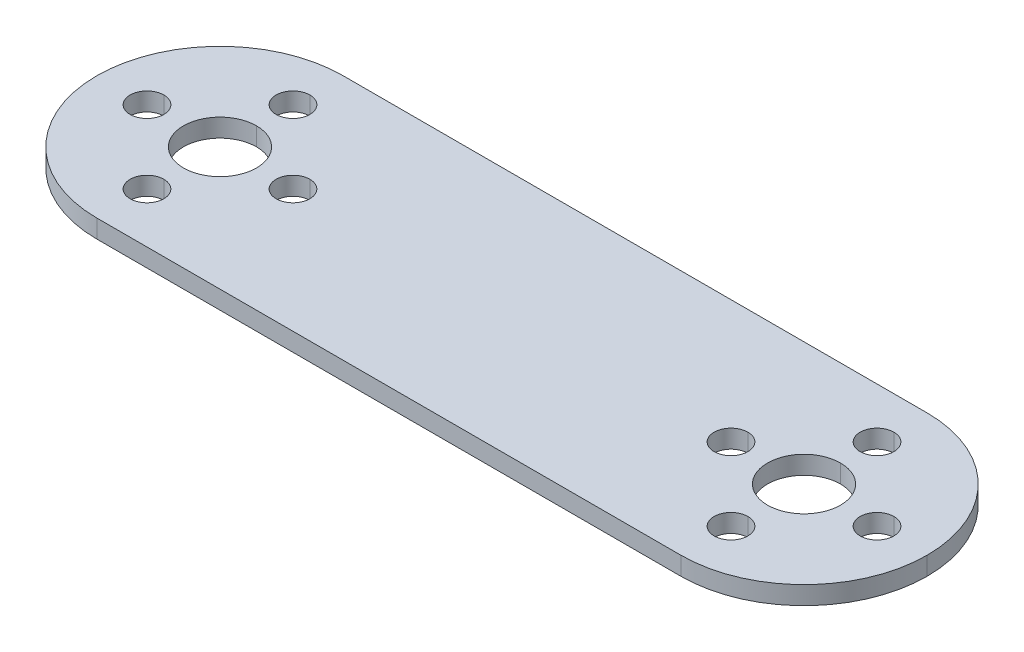
ISO-10303-21;
HEADER;
FILE_DESCRIPTION(('STEP AP214'),'2;1');
FILE_NAME('part.step','',(''),(''),'','','');
FILE_SCHEMA(('AUTOMOTIVE_DESIGN { 1 0 10303 214 1 1 1 1 }'));
ENDSEC;
DATA;
#1=APPLICATION_CONTEXT('core data for automotive mechanical design processes');
#2=APPLICATION_PROTOCOL_DEFINITION('international standard','automotive_design',2000,#1);
#3=PRODUCT_CONTEXT('',#1,'mechanical');
#4=PRODUCT('Part','Part','',(#3));
#5=PRODUCT_RELATED_PRODUCT_CATEGORY('part','',(#4));
#6=PRODUCT_DEFINITION_FORMATION('','',#4);
#7=PRODUCT_DEFINITION_CONTEXT('part definition',#1,'design');
#8=PRODUCT_DEFINITION('design','',#6,#7);
#9=PRODUCT_DEFINITION_SHAPE('','',#8);
#10=(LENGTH_UNIT() NAMED_UNIT(*) SI_UNIT(.MILLI.,.METRE.));
#11=(NAMED_UNIT(*) PLANE_ANGLE_UNIT() SI_UNIT($,.RADIAN.));
#12=(NAMED_UNIT(*) SI_UNIT($,.STERADIAN.) SOLID_ANGLE_UNIT());
#13=UNCERTAINTY_MEASURE_WITH_UNIT(LENGTH_MEASURE(1.E-05),#10,'distance_accuracy_value','');
#14=(GEOMETRIC_REPRESENTATION_CONTEXT(3) GLOBAL_UNCERTAINTY_ASSIGNED_CONTEXT((#13)) GLOBAL_UNIT_ASSIGNED_CONTEXT((#10,
#11,#12)) REPRESENTATION_CONTEXT('',''));
#15=CARTESIAN_POINT('',(0.,0.,0.));
#16=DIRECTION('',(0.,0.,1.));
#17=DIRECTION('',(1.,0.,0.));
#18=AXIS2_PLACEMENT_3D('',#15,#16,#17);
#19=CARTESIAN_POINT('',(-32.,2.,0.));
#20=DIRECTION('',(0.,-1.,0.));
#21=DIRECTION('',(0.,0.,-1.));
#22=AXIS2_PLACEMENT_3D('',#19,#20,#21);
#23=CYLINDRICAL_SURFACE('',#22,13.5);
#24=CARTESIAN_POINT('',(-32.,2.,0.));
#25=DIRECTION('',(0.,1.,0.));
#26=DIRECTION('',(0.,0.,1.));
#27=AXIS2_PLACEMENT_3D('',#24,#25,#26);
#28=CIRCLE('',#27,13.5);
#29=CARTESIAN_POINT('',(-45.5,2.,0.));
#30=VERTEX_POINT('',#29);
#31=CARTESIAN_POINT('',(-32.,2.,13.5));
#32=VERTEX_POINT('',#31);
#33=EDGE_CURVE('E390',#30,#32,#28,.T.);
#34=ORIENTED_EDGE('',*,*,#33,.F.);
#35=DIRECTION('',(0.,-1.,0.));
#36=VECTOR('',#35,1.);
#37=CARTESIAN_POINT('',(-45.5,2.,0.));
#38=LINE('',#37,#36);
#39=CARTESIAN_POINT('',(-45.5,0.,0.));
#40=VERTEX_POINT('',#39);
#41=EDGE_CURVE('E9',#30,#40,#38,.T.);
#42=ORIENTED_EDGE('',*,*,#41,.T.);
#43=CARTESIAN_POINT('',(-32.,0.,0.));
#44=DIRECTION('',(0.,-1.,0.));
#45=DIRECTION('',(0.,0.,1.));
#46=AXIS2_PLACEMENT_3D('',#43,#44,#45);
#47=CIRCLE('',#46,13.5);
#48=CARTESIAN_POINT('',(-32.,0.,13.5));
#49=VERTEX_POINT('',#48);
#50=EDGE_CURVE('E371',#49,#40,#47,.T.);
#51=ORIENTED_EDGE('',*,*,#50,.F.);
#52=DIRECTION('',(0.,-1.,0.));
#53=VECTOR('',#52,1.);
#54=CARTESIAN_POINT('',(-32.,2.,13.5));
#55=LINE('',#54,#53);
#56=EDGE_CURVE('E330',#32,#49,#55,.T.);
#57=ORIENTED_EDGE('',*,*,#56,.F.);
#58=EDGE_LOOP('',(#34,#42,#51,#57));
#59=FACE_BOUND('',#58,.T.);
#60=ADVANCED_FACE('F14',(#59),#23,.T.);
#61=CARTESIAN_POINT('',(-32.,2.,0.));
#62=DIRECTION('',(0.,-1.,0.));
#63=DIRECTION('',(0.,0.,-1.));
#64=AXIS2_PLACEMENT_3D('',#61,#62,#63);
#65=CYLINDRICAL_SURFACE('',#64,13.5);
#66=ORIENTED_EDGE('',*,*,#41,.F.);
#67=CARTESIAN_POINT('',(-32.,2.,0.));
#68=DIRECTION('',(0.,1.,0.));
#69=DIRECTION('',(0.,0.,1.));
#70=AXIS2_PLACEMENT_3D('',#67,#68,#69);
#71=CIRCLE('',#70,13.5);
#72=CARTESIAN_POINT('',(-32.,2.,-13.5));
#73=VERTEX_POINT('',#72);
#74=EDGE_CURVE('E386',#73,#30,#71,.T.);
#75=ORIENTED_EDGE('',*,*,#74,.F.);
#76=DIRECTION('',(0.,1.,0.));
#77=VECTOR('',#76,1.);
#78=CARTESIAN_POINT('',(-32.,2.,-13.5));
#79=LINE('',#78,#77);
#80=CARTESIAN_POINT('',(-32.,0.,-13.5));
#81=VERTEX_POINT('',#80);
#82=EDGE_CURVE('E424',#81,#73,#79,.T.);
#83=ORIENTED_EDGE('',*,*,#82,.F.);
#84=CARTESIAN_POINT('',(-32.,0.,0.));
#85=DIRECTION('',(0.,-1.,0.));
#86=DIRECTION('',(0.,0.,1.));
#87=AXIS2_PLACEMENT_3D('',#84,#85,#86);
#88=CIRCLE('',#87,13.5);
#89=EDGE_CURVE('E367',#40,#81,#88,.T.);
#90=ORIENTED_EDGE('',*,*,#89,.F.);
#91=EDGE_LOOP('',(#66,#75,#83,#90));
#92=FACE_BOUND('',#91,.T.);
#93=ADVANCED_FACE('F711',(#92),#65,.T.);
#94=CARTESIAN_POINT('',(32.,2.,0.));
#95=DIRECTION('',(0.,-1.,0.));
#96=DIRECTION('',(0.,0.,-1.));
#97=AXIS2_PLACEMENT_3D('',#94,#95,#96);
#98=CYLINDRICAL_SURFACE('',#97,13.5);
#99=CARTESIAN_POINT('',(32.,2.,0.));
#100=DIRECTION('',(0.,1.,0.));
#101=DIRECTION('',(0.,0.,1.));
#102=AXIS2_PLACEMENT_3D('',#99,#100,#101);
#103=CIRCLE('',#102,13.5);
#104=CARTESIAN_POINT('',(32.,2.,13.5));
#105=VERTEX_POINT('',#104);
#106=CARTESIAN_POINT('',(45.5,2.,0.));
#107=VERTEX_POINT('',#106);
#108=EDGE_CURVE('E325',#105,#107,#103,.T.);
#109=ORIENTED_EDGE('',*,*,#108,.F.);
#110=DIRECTION('',(0.,1.,0.));
#111=VECTOR('',#110,1.);
#112=CARTESIAN_POINT('',(32.,2.,13.5));
#113=LINE('',#112,#111);
#114=CARTESIAN_POINT('',(32.,0.,13.5));
#115=VERTEX_POINT('',#114);
#116=EDGE_CURVE('E408',#115,#105,#113,.T.);
#117=ORIENTED_EDGE('',*,*,#116,.F.);
#118=CARTESIAN_POINT('',(32.,0.,0.));
#119=DIRECTION('',(0.,-1.,0.));
#120=DIRECTION('',(0.,0.,1.));
#121=AXIS2_PLACEMENT_3D('',#118,#119,#120);
#122=CIRCLE('',#121,13.5);
#123=CARTESIAN_POINT('',(45.5,0.,0.));
#124=VERTEX_POINT('',#123);
#125=EDGE_CURVE('E361',#124,#115,#122,.T.);
#126=ORIENTED_EDGE('',*,*,#125,.F.);
#127=DIRECTION('',(0.,1.,0.));
#128=VECTOR('',#127,1.);
#129=CARTESIAN_POINT('',(45.5,2.,0.));
#130=LINE('',#129,#128);
#131=EDGE_CURVE('E25',#124,#107,#130,.T.);
#132=ORIENTED_EDGE('',*,*,#131,.T.);
#133=EDGE_LOOP('',(#109,#117,#126,#132));
#134=FACE_BOUND('',#133,.T.);
#135=ADVANCED_FACE('F776',(#134),#98,.T.);
#136=CARTESIAN_POINT('',(32.,2.,0.));
#137=DIRECTION('',(0.,-1.,0.));
#138=DIRECTION('',(0.,0.,-1.));
#139=AXIS2_PLACEMENT_3D('',#136,#137,#138);
#140=CYLINDRICAL_SURFACE('',#139,13.5);
#141=DIRECTION('',(0.,-1.,0.));
#142=VECTOR('',#141,1.);
#143=CARTESIAN_POINT('',(32.,2.,-13.5));
#144=LINE('',#143,#142);
#145=CARTESIAN_POINT('',(32.,2.,-13.5));
#146=VERTEX_POINT('',#145);
#147=CARTESIAN_POINT('',(32.,0.,-13.5));
#148=VERTEX_POINT('',#147);
#149=EDGE_CURVE('E334',#146,#148,#144,.T.);
#150=ORIENTED_EDGE('',*,*,#149,.F.);
#151=CARTESIAN_POINT('',(32.,2.,0.));
#152=DIRECTION('',(0.,1.,0.));
#153=DIRECTION('',(0.,0.,1.));
#154=AXIS2_PLACEMENT_3D('',#151,#152,#153);
#155=CIRCLE('',#154,13.5);
#156=EDGE_CURVE('E329',#107,#146,#155,.T.);
#157=ORIENTED_EDGE('',*,*,#156,.F.);
#158=ORIENTED_EDGE('',*,*,#131,.F.);
#159=CARTESIAN_POINT('',(32.,0.,0.));
#160=DIRECTION('',(0.,-1.,0.));
#161=DIRECTION('',(0.,0.,1.));
#162=AXIS2_PLACEMENT_3D('',#159,#160,#161);
#163=CIRCLE('',#162,13.5);
#164=EDGE_CURVE('E357',#148,#124,#163,.T.);
#165=ORIENTED_EDGE('',*,*,#164,.F.);
#166=EDGE_LOOP('',(#150,#157,#158,#165));
#167=FACE_BOUND('',#166,.T.);
#168=ADVANCED_FACE('F578',(#167),#140,.T.);
#169=CARTESIAN_POINT('',(32.,0.,-8.));
#170=DIRECTION('',(0.,1.,0.));
#171=DIRECTION('',(0.,0.,1.));
#172=AXIS2_PLACEMENT_3D('',#169,#170,#171);
#173=CYLINDRICAL_SURFACE('',#172,1.85);
#174=DIRECTION('',(0.,1.,0.));
#175=VECTOR('',#174,1.);
#176=CARTESIAN_POINT('',(32.,0.,-9.85));
#177=LINE('',#176,#175);
#178=CARTESIAN_POINT('',(32.,0.,-9.85));
#179=VERTEX_POINT('',#178);
#180=CARTESIAN_POINT('',(32.,2.,-9.85));
#181=VERTEX_POINT('',#180);
#182=EDGE_CURVE('E450',#179,#181,#177,.T.);
#183=ORIENTED_EDGE('',*,*,#182,.F.);
#184=CARTESIAN_POINT('',(32.,0.,-8.));
#185=DIRECTION('',(0.,1.,0.));
#186=DIRECTION('',(0.,0.,1.));
#187=AXIS2_PLACEMENT_3D('',#184,#185,#186);
#188=CIRCLE('',#187,1.85);
#189=CARTESIAN_POINT('',(32.,0.,-6.15));
#190=VERTEX_POINT('',#189);
#191=EDGE_CURVE('E370',#190,#179,#188,.T.);
#192=ORIENTED_EDGE('',*,*,#191,.F.);
#193=DIRECTION('',(0.,1.,0.));
#194=VECTOR('',#193,1.);
#195=CARTESIAN_POINT('',(32.,0.,-6.15));
#196=LINE('',#195,#194);
#197=CARTESIAN_POINT('',(32.,2.,-6.15));
#198=VERTEX_POINT('',#197);
#199=EDGE_CURVE('E439',#190,#198,#196,.T.);
#200=ORIENTED_EDGE('',*,*,#199,.T.);
#201=CARTESIAN_POINT('',(32.,2.,-8.));
#202=DIRECTION('',(0.,1.,0.));
#203=DIRECTION('',(0.,0.,1.));
#204=AXIS2_PLACEMENT_3D('',#201,#202,#203);
#205=CIRCLE('',#204,1.85);
#206=EDGE_CURVE('E423',#198,#181,#205,.T.);
#207=ORIENTED_EDGE('',*,*,#206,.T.);
#208=EDGE_LOOP('',(#183,#192,#200,#207));
#209=FACE_BOUND('',#208,.T.);
#210=ADVANCED_FACE('F572',(#209),#173,.F.);
#211=CARTESIAN_POINT('',(32.,0.,8.));
#212=DIRECTION('',(0.,1.,0.));
#213=DIRECTION('',(0.,0.,1.));
#214=AXIS2_PLACEMENT_3D('',#211,#212,#213);
#215=CYLINDRICAL_SURFACE('',#214,1.85);
#216=DIRECTION('',(0.,1.,0.));
#217=VECTOR('',#216,1.);
#218=CARTESIAN_POINT('',(32.,0.,6.15));
#219=LINE('',#218,#217);
#220=CARTESIAN_POINT('',(32.,0.,6.15));
#221=VERTEX_POINT('',#220);
#222=CARTESIAN_POINT('',(32.,2.,6.15));
#223=VERTEX_POINT('',#222);
#224=EDGE_CURVE('E431',#221,#223,#219,.T.);
#225=ORIENTED_EDGE('',*,*,#224,.F.);
#226=CARTESIAN_POINT('',(32.,0.,8.));
#227=DIRECTION('',(0.,1.,0.));
#228=DIRECTION('',(0.,0.,1.));
#229=AXIS2_PLACEMENT_3D('',#226,#227,#228);
#230=CIRCLE('',#229,1.85);
#231=CARTESIAN_POINT('',(32.,0.,9.85));
#232=VERTEX_POINT('',#231);
#233=EDGE_CURVE('E380',#232,#221,#230,.T.);
#234=ORIENTED_EDGE('',*,*,#233,.F.);
#235=DIRECTION('',(0.,1.,0.));
#236=VECTOR('',#235,1.);
#237=CARTESIAN_POINT('',(32.,0.,9.85));
#238=LINE('',#237,#236);
#239=CARTESIAN_POINT('',(32.,2.,9.85));
#240=VERTEX_POINT('',#239);
#241=EDGE_CURVE('E496',#232,#240,#238,.T.);
#242=ORIENTED_EDGE('',*,*,#241,.T.);
#243=CARTESIAN_POINT('',(32.,2.,8.));
#244=DIRECTION('',(0.,1.,0.));
#245=DIRECTION('',(0.,0.,1.));
#246=AXIS2_PLACEMENT_3D('',#243,#244,#245);
#247=CIRCLE('',#246,1.85);
#248=EDGE_CURVE('E460',#240,#223,#247,.T.);
#249=ORIENTED_EDGE('',*,*,#248,.T.);
#250=EDGE_LOOP('',(#225,#234,#242,#249));
#251=FACE_BOUND('',#250,.T.);
#252=ADVANCED_FACE('F577',(#251),#215,.F.);
#253=CARTESIAN_POINT('',(24.,0.,0.));
#254=DIRECTION('',(0.,1.,0.));
#255=DIRECTION('',(0.,0.,1.));
#256=AXIS2_PLACEMENT_3D('',#253,#254,#255);
#257=CYLINDRICAL_SURFACE('',#256,1.85);
#258=DIRECTION('',(0.,1.,0.));
#259=VECTOR('',#258,1.);
#260=CARTESIAN_POINT('',(24.,0.,-1.85));
#261=LINE('',#260,#259);
#262=CARTESIAN_POINT('',(24.,0.,-1.85));
#263=VERTEX_POINT('',#262);
#264=CARTESIAN_POINT('',(24.,2.,-1.85));
#265=VERTEX_POINT('',#264);
#266=EDGE_CURVE('E473',#263,#265,#261,.T.);
#267=ORIENTED_EDGE('',*,*,#266,.F.);
#268=CARTESIAN_POINT('',(24.,0.,0.));
#269=DIRECTION('',(0.,1.,0.));
#270=DIRECTION('',(0.,0.,1.));
#271=AXIS2_PLACEMENT_3D('',#268,#269,#270);
#272=CIRCLE('',#271,1.85);
#273=CARTESIAN_POINT('',(24.,0.,1.85));
#274=VERTEX_POINT('',#273);
#275=EDGE_CURVE('E377',#274,#263,#272,.T.);
#276=ORIENTED_EDGE('',*,*,#275,.F.);
#277=DIRECTION('',(0.,1.,0.));
#278=VECTOR('',#277,1.);
#279=CARTESIAN_POINT('',(24.,0.,1.85));
#280=LINE('',#279,#278);
#281=CARTESIAN_POINT('',(24.,2.,1.85));
#282=VERTEX_POINT('',#281);
#283=EDGE_CURVE('E376',#274,#282,#280,.T.);
#284=ORIENTED_EDGE('',*,*,#283,.T.);
#285=CARTESIAN_POINT('',(24.,2.,0.));
#286=DIRECTION('',(0.,1.,0.));
#287=DIRECTION('',(0.,0.,1.));
#288=AXIS2_PLACEMENT_3D('',#285,#286,#287);
#289=CIRCLE('',#288,1.85);
#290=EDGE_CURVE('E249',#282,#265,#289,.T.);
#291=ORIENTED_EDGE('',*,*,#290,.T.);
#292=EDGE_LOOP('',(#267,#276,#284,#291));
#293=FACE_BOUND('',#292,.T.);
#294=ADVANCED_FACE('F594',(#293),#257,.F.);
#295=CARTESIAN_POINT('',(40.,0.,0.));
#296=DIRECTION('',(0.,1.,0.));
#297=DIRECTION('',(0.,0.,1.));
#298=AXIS2_PLACEMENT_3D('',#295,#296,#297);
#299=CYLINDRICAL_SURFACE('',#298,1.85);
#300=DIRECTION('',(0.,1.,0.));
#301=VECTOR('',#300,1.);
#302=CARTESIAN_POINT('',(40.,0.,-1.85));
#303=LINE('',#302,#301);
#304=CARTESIAN_POINT('',(40.,0.,-1.85));
#305=VERTEX_POINT('',#304);
#306=CARTESIAN_POINT('',(40.,2.,-1.85));
#307=VERTEX_POINT('',#306);
#308=EDGE_CURVE('E375',#305,#307,#303,.T.);
#309=ORIENTED_EDGE('',*,*,#308,.F.);
#310=CARTESIAN_POINT('',(40.,0.,0.));
#311=DIRECTION('',(0.,1.,0.));
#312=DIRECTION('',(0.,0.,1.));
#313=AXIS2_PLACEMENT_3D('',#310,#311,#312);
#314=CIRCLE('',#313,1.85);
#315=CARTESIAN_POINT('',(40.,0.,1.85));
#316=VERTEX_POINT('',#315);
#317=EDGE_CURVE('E240',#316,#305,#314,.T.);
#318=ORIENTED_EDGE('',*,*,#317,.F.);
#319=DIRECTION('',(0.,1.,0.));
#320=VECTOR('',#319,1.);
#321=CARTESIAN_POINT('',(40.,0.,1.85));
#322=LINE('',#321,#320);
#323=CARTESIAN_POINT('',(40.,2.,1.85));
#324=VERTEX_POINT('',#323);
#325=EDGE_CURVE('E318',#316,#324,#322,.T.);
#326=ORIENTED_EDGE('',*,*,#325,.T.);
#327=CARTESIAN_POINT('',(40.,2.,0.));
#328=DIRECTION('',(0.,1.,0.));
#329=DIRECTION('',(0.,0.,1.));
#330=AXIS2_PLACEMENT_3D('',#327,#328,#329);
#331=CIRCLE('',#330,1.85);
#332=EDGE_CURVE('E347',#324,#307,#331,.T.);
#333=ORIENTED_EDGE('',*,*,#332,.T.);
#334=EDGE_LOOP('',(#309,#318,#326,#333));
#335=FACE_BOUND('',#334,.T.);
#336=ADVANCED_FACE('F588',(#335),#299,.F.);
#337=CARTESIAN_POINT('',(32.,0.,0.));
#338=DIRECTION('',(0.,1.,0.));
#339=DIRECTION('',(0.,0.,1.));
#340=AXIS2_PLACEMENT_3D('',#337,#338,#339);
#341=CYLINDRICAL_SURFACE('',#340,4.);
#342=DIRECTION('',(0.,1.,0.));
#343=VECTOR('',#342,1.);
#344=CARTESIAN_POINT('',(32.,0.,-4.));
#345=LINE('',#344,#343);
#346=CARTESIAN_POINT('',(32.,0.,-4.));
#347=VERTEX_POINT('',#346);
#348=CARTESIAN_POINT('',(32.,2.,-4.));
#349=VERTEX_POINT('',#348);
#350=EDGE_CURVE('E317',#347,#349,#345,.T.);
#351=ORIENTED_EDGE('',*,*,#350,.F.);
#352=CARTESIAN_POINT('',(32.,0.,0.));
#353=DIRECTION('',(0.,1.,0.));
#354=DIRECTION('',(0.,0.,1.));
#355=AXIS2_PLACEMENT_3D('',#352,#353,#354);
#356=CIRCLE('',#355,4.);
#357=CARTESIAN_POINT('',(32.,0.,4.));
#358=VERTEX_POINT('',#357);
#359=EDGE_CURVE('E385',#358,#347,#356,.T.);
#360=ORIENTED_EDGE('',*,*,#359,.F.);
#361=DIRECTION('',(0.,1.,0.));
#362=VECTOR('',#361,1.);
#363=CARTESIAN_POINT('',(32.,0.,4.));
#364=LINE('',#363,#362);
#365=CARTESIAN_POINT('',(32.,2.,4.));
#366=VERTEX_POINT('',#365);
#367=EDGE_CURVE('E299',#358,#366,#364,.T.);
#368=ORIENTED_EDGE('',*,*,#367,.T.);
#369=CARTESIAN_POINT('',(32.,2.,0.));
#370=DIRECTION('',(0.,1.,0.));
#371=DIRECTION('',(0.,0.,1.));
#372=AXIS2_PLACEMENT_3D('',#369,#370,#371);
#373=CIRCLE('',#372,4.);
#374=EDGE_CURVE('E350',#366,#349,#373,.T.);
#375=ORIENTED_EDGE('',*,*,#374,.T.);
#376=EDGE_LOOP('',(#351,#360,#368,#375));
#377=FACE_BOUND('',#376,.T.);
#378=ADVANCED_FACE('F593',(#377),#341,.F.);
#379=CARTESIAN_POINT('',(-32.,0.,-8.));
#380=DIRECTION('',(0.,1.,0.));
#381=DIRECTION('',(0.,0.,1.));
#382=AXIS2_PLACEMENT_3D('',#379,#380,#381);
#383=CYLINDRICAL_SURFACE('',#382,1.85);
#384=DIRECTION('',(0.,1.,0.));
#385=VECTOR('',#384,1.);
#386=CARTESIAN_POINT('',(-32.,0.,-9.85));
#387=LINE('',#386,#385);
#388=CARTESIAN_POINT('',(-32.,0.,-9.85));
#389=VERTEX_POINT('',#388);
#390=CARTESIAN_POINT('',(-32.,2.,-9.85));
#391=VERTEX_POINT('',#390);
#392=EDGE_CURVE('E477',#389,#391,#387,.T.);
#393=ORIENTED_EDGE('',*,*,#392,.F.);
#394=CARTESIAN_POINT('',(-32.,0.,-8.));
#395=DIRECTION('',(0.,1.,0.));
#396=DIRECTION('',(0.,0.,1.));
#397=AXIS2_PLACEMENT_3D('',#394,#395,#396);
#398=CIRCLE('',#397,1.85);
#399=CARTESIAN_POINT('',(-32.,0.,-6.15));
#400=VERTEX_POINT('',#399);
#401=EDGE_CURVE('E381',#400,#389,#398,.T.);
#402=ORIENTED_EDGE('',*,*,#401,.F.);
#403=DIRECTION('',(0.,1.,0.));
#404=VECTOR('',#403,1.);
#405=CARTESIAN_POINT('',(-32.,0.,-6.15));
#406=LINE('',#405,#404);
#407=CARTESIAN_POINT('',(-32.,2.,-6.15));
#408=VERTEX_POINT('',#407);
#409=EDGE_CURVE('E409',#400,#408,#406,.T.);
#410=ORIENTED_EDGE('',*,*,#409,.T.);
#411=CARTESIAN_POINT('',(-32.,2.,-8.));
#412=DIRECTION('',(0.,1.,0.));
#413=DIRECTION('',(0.,0.,1.));
#414=AXIS2_PLACEMENT_3D('',#411,#412,#413);
#415=CIRCLE('',#414,1.85);
#416=EDGE_CURVE('E346',#408,#391,#415,.T.);
#417=ORIENTED_EDGE('',*,*,#416,.T.);
#418=EDGE_LOOP('',(#393,#402,#410,#417));
#419=FACE_BOUND('',#418,.T.);
#420=ADVANCED_FACE('F648',(#419),#383,.F.);
#421=CARTESIAN_POINT('',(-32.,0.,8.));
#422=DIRECTION('',(0.,1.,0.));
#423=DIRECTION('',(0.,0.,1.));
#424=AXIS2_PLACEMENT_3D('',#421,#422,#423);
#425=CYLINDRICAL_SURFACE('',#424,1.85);
#426=DIRECTION('',(0.,1.,0.));
#427=VECTOR('',#426,1.);
#428=CARTESIAN_POINT('',(-32.,0.,6.15));
#429=LINE('',#428,#427);
#430=CARTESIAN_POINT('',(-32.,0.,6.15));
#431=VERTEX_POINT('',#430);
#432=CARTESIAN_POINT('',(-32.,2.,6.15));
#433=VERTEX_POINT('',#432);
#434=EDGE_CURVE('E417',#431,#433,#429,.T.);
#435=ORIENTED_EDGE('',*,*,#434,.F.);
#436=CARTESIAN_POINT('',(-32.,0.,8.));
#437=DIRECTION('',(0.,1.,0.));
#438=DIRECTION('',(0.,0.,1.));
#439=AXIS2_PLACEMENT_3D('',#436,#437,#438);
#440=CIRCLE('',#439,1.85);
#441=CARTESIAN_POINT('',(-32.,0.,9.85));
#442=VERTEX_POINT('',#441);
#443=EDGE_CURVE('E96',#442,#431,#440,.T.);
#444=ORIENTED_EDGE('',*,*,#443,.F.);
#445=DIRECTION('',(0.,1.,0.));
#446=VECTOR('',#445,1.);
#447=CARTESIAN_POINT('',(-32.,0.,9.85));
#448=LINE('',#447,#446);
#449=CARTESIAN_POINT('',(-32.,2.,9.85));
#450=VERTEX_POINT('',#449);
#451=EDGE_CURVE('E309',#442,#450,#448,.T.);
#452=ORIENTED_EDGE('',*,*,#451,.T.);
#453=CARTESIAN_POINT('',(-32.,2.,8.));
#454=DIRECTION('',(0.,1.,0.));
#455=DIRECTION('',(0.,0.,1.));
#456=AXIS2_PLACEMENT_3D('',#453,#454,#455);
#457=CIRCLE('',#456,1.85);
#458=EDGE_CURVE('E343',#450,#433,#457,.T.);
#459=ORIENTED_EDGE('',*,*,#458,.T.);
#460=EDGE_LOOP('',(#435,#444,#452,#459));
#461=FACE_BOUND('',#460,.T.);
#462=ADVANCED_FACE('F653',(#461),#425,.F.);
#463=CARTESIAN_POINT('',(-40.,0.,0.));
#464=DIRECTION('',(0.,1.,0.));
#465=DIRECTION('',(0.,0.,1.));
#466=AXIS2_PLACEMENT_3D('',#463,#464,#465);
#467=CYLINDRICAL_SURFACE('',#466,1.85);
#468=DIRECTION('',(0.,1.,0.));
#469=VECTOR('',#468,1.);
#470=CARTESIAN_POINT('',(-40.,0.,-1.85));
#471=LINE('',#470,#469);
#472=CARTESIAN_POINT('',(-40.,0.,-1.85));
#473=VERTEX_POINT('',#472);
#474=CARTESIAN_POINT('',(-40.,2.,-1.85));
#475=VERTEX_POINT('',#474);
#476=EDGE_CURVE('E308',#473,#475,#471,.T.);
#477=ORIENTED_EDGE('',*,*,#476,.F.);
#478=CARTESIAN_POINT('',(-40.,0.,0.));
#479=DIRECTION('',(0.,1.,0.));
#480=DIRECTION('',(0.,0.,1.));
#481=AXIS2_PLACEMENT_3D('',#478,#479,#480);
#482=CIRCLE('',#481,1.85);
#483=CARTESIAN_POINT('',(-40.,0.,1.85));
#484=VERTEX_POINT('',#483);
#485=EDGE_CURVE('E362',#484,#473,#482,.T.);
#486=ORIENTED_EDGE('',*,*,#485,.F.);
#487=DIRECTION('',(0.,1.,0.));
#488=VECTOR('',#487,1.);
#489=CARTESIAN_POINT('',(-40.,0.,1.85));
#490=LINE('',#489,#488);
#491=CARTESIAN_POINT('',(-40.,2.,1.85));
#492=VERTEX_POINT('',#491);
#493=EDGE_CURVE('E463',#484,#492,#490,.T.);
#494=ORIENTED_EDGE('',*,*,#493,.T.);
#495=CARTESIAN_POINT('',(-40.,2.,0.));
#496=DIRECTION('',(0.,1.,0.));
#497=DIRECTION('',(0.,0.,1.));
#498=AXIS2_PLACEMENT_3D('',#495,#496,#497);
#499=CIRCLE('',#498,1.85);
#500=EDGE_CURVE('E272',#492,#475,#499,.T.);
#501=ORIENTED_EDGE('',*,*,#500,.T.);
#502=EDGE_LOOP('',(#477,#486,#494,#501));
#503=FACE_BOUND('',#502,.T.);
#504=ADVANCED_FACE('F662',(#503),#467,.F.);
#505=CARTESIAN_POINT('',(-24.,0.,0.));
#506=DIRECTION('',(0.,1.,0.));
#507=DIRECTION('',(0.,0.,1.));
#508=AXIS2_PLACEMENT_3D('',#505,#506,#507);
#509=CYLINDRICAL_SURFACE('',#508,1.85);
#510=DIRECTION('',(0.,1.,0.));
#511=VECTOR('',#510,1.);
#512=CARTESIAN_POINT('',(-24.,0.,-1.85));
#513=LINE('',#512,#511);
#514=CARTESIAN_POINT('',(-24.,0.,-1.85));
#515=VERTEX_POINT('',#514);
#516=CARTESIAN_POINT('',(-24.,2.,-1.85));
#517=VERTEX_POINT('',#516);
#518=EDGE_CURVE('E285',#515,#517,#513,.T.);
#519=ORIENTED_EDGE('',*,*,#518,.F.);
#520=CARTESIAN_POINT('',(-24.,0.,0.));
#521=DIRECTION('',(0.,1.,0.));
#522=DIRECTION('',(0.,0.,1.));
#523=AXIS2_PLACEMENT_3D('',#520,#521,#522);
#524=CIRCLE('',#523,1.85);
#525=CARTESIAN_POINT('',(-24.,0.,1.85));
#526=VERTEX_POINT('',#525);
#527=EDGE_CURVE('E277',#526,#515,#524,.T.);
#528=ORIENTED_EDGE('',*,*,#527,.F.);
#529=DIRECTION('',(0.,1.,0.));
#530=VECTOR('',#529,1.);
#531=CARTESIAN_POINT('',(-24.,0.,1.85));
#532=LINE('',#531,#530);
#533=CARTESIAN_POINT('',(-24.,2.,1.85));
#534=VERTEX_POINT('',#533);
#535=EDGE_CURVE('E275',#526,#534,#532,.T.);
#536=ORIENTED_EDGE('',*,*,#535,.T.);
#537=CARTESIAN_POINT('',(-24.,2.,0.));
#538=DIRECTION('',(0.,1.,0.));
#539=DIRECTION('',(0.,0.,1.));
#540=AXIS2_PLACEMENT_3D('',#537,#538,#539);
#541=CIRCLE('',#540,1.85);
#542=EDGE_CURVE('E261',#534,#517,#541,.T.);
#543=ORIENTED_EDGE('',*,*,#542,.T.);
#544=EDGE_LOOP('',(#519,#528,#536,#543));
#545=FACE_BOUND('',#544,.T.);
#546=ADVANCED_FACE('F276',(#545),#509,.F.);
#547=CARTESIAN_POINT('',(-32.,0.,0.));
#548=DIRECTION('',(0.,1.,0.));
#549=DIRECTION('',(0.,0.,1.));
#550=AXIS2_PLACEMENT_3D('',#547,#548,#549);
#551=CYLINDRICAL_SURFACE('',#550,4.);
#552=DIRECTION('',(0.,1.,0.));
#553=VECTOR('',#552,1.);
#554=CARTESIAN_POINT('',(-32.,0.,-4.));
#555=LINE('',#554,#553);
#556=CARTESIAN_POINT('',(-32.,0.,-4.));
#557=VERTEX_POINT('',#556);
#558=CARTESIAN_POINT('',(-32.,2.,-4.));
#559=VERTEX_POINT('',#558);
#560=EDGE_CURVE('E324',#557,#559,#555,.T.);
#561=ORIENTED_EDGE('',*,*,#560,.F.);
#562=CARTESIAN_POINT('',(-32.,0.,0.));
#563=DIRECTION('',(0.,1.,0.));
#564=DIRECTION('',(0.,0.,1.));
#565=AXIS2_PLACEMENT_3D('',#562,#563,#564);
#566=CIRCLE('',#565,4.);
#567=CARTESIAN_POINT('',(-32.,0.,4.));
#568=VERTEX_POINT('',#567);
#569=EDGE_CURVE('E312',#568,#557,#566,.T.);
#570=ORIENTED_EDGE('',*,*,#569,.F.);
#571=DIRECTION('',(0.,1.,0.));
#572=VECTOR('',#571,1.);
#573=CARTESIAN_POINT('',(-32.,0.,4.));
#574=LINE('',#573,#572);
#575=CARTESIAN_POINT('',(-32.,2.,4.));
#576=VERTEX_POINT('',#575);
#577=EDGE_CURVE('E323',#568,#576,#574,.T.);
#578=ORIENTED_EDGE('',*,*,#577,.T.);
#579=CARTESIAN_POINT('',(-32.,2.,0.));
#580=DIRECTION('',(0.,1.,0.));
#581=DIRECTION('',(0.,0.,1.));
#582=AXIS2_PLACEMENT_3D('',#579,#580,#581);
#583=CIRCLE('',#582,4.);
#584=EDGE_CURVE('E271',#576,#559,#583,.T.);
#585=ORIENTED_EDGE('',*,*,#584,.T.);
#586=EDGE_LOOP('',(#561,#570,#578,#585));
#587=FACE_BOUND('',#586,.T.);
#588=ADVANCED_FACE('F557',(#587),#551,.F.);
#589=CARTESIAN_POINT('',(0.,0.,0.));
#590=DIRECTION('',(0.,1.,0.));
#591=DIRECTION('',(1.,0.,0.));
#592=AXIS2_PLACEMENT_3D('',#589,#590,#591);
#593=PLANE('',#592);
#594=ORIENTED_EDGE('',*,*,#569,.T.);
#595=CARTESIAN_POINT('',(-32.,0.,0.));
#596=DIRECTION('',(0.,1.,0.));
#597=DIRECTION('',(0.,0.,1.));
#598=AXIS2_PLACEMENT_3D('',#595,#596,#597);
#599=CIRCLE('',#598,4.);
#600=EDGE_CURVE('E282',#557,#568,#599,.T.);
#601=ORIENTED_EDGE('',*,*,#600,.T.);
#602=EDGE_LOOP('',(#594,#601));
#603=FACE_BOUND('',#602,.T.);
#604=ORIENTED_EDGE('',*,*,#527,.T.);
#605=CARTESIAN_POINT('',(-24.,0.,0.));
#606=DIRECTION('',(0.,1.,0.));
#607=DIRECTION('',(0.,0.,1.));
#608=AXIS2_PLACEMENT_3D('',#605,#606,#607);
#609=CIRCLE('',#608,1.85);
#610=EDGE_CURVE('E293',#515,#526,#609,.T.);
#611=ORIENTED_EDGE('',*,*,#610,.T.);
#612=EDGE_LOOP('',(#604,#611));
#613=FACE_BOUND('',#612,.T.);
#614=ORIENTED_EDGE('',*,*,#485,.T.);
#615=CARTESIAN_POINT('',(-40.,0.,0.));
#616=DIRECTION('',(0.,1.,0.));
#617=DIRECTION('',(0.,0.,1.));
#618=AXIS2_PLACEMENT_3D('',#615,#616,#617);
#619=CIRCLE('',#618,1.85);
#620=EDGE_CURVE('E304',#473,#484,#619,.T.);
#621=ORIENTED_EDGE('',*,*,#620,.T.);
#622=EDGE_LOOP('',(#614,#621));
#623=FACE_BOUND('',#622,.T.);
#624=ORIENTED_EDGE('',*,*,#443,.T.);
#625=CARTESIAN_POINT('',(-32.,0.,8.));
#626=DIRECTION('',(0.,1.,0.));
#627=DIRECTION('',(0.,0.,1.));
#628=AXIS2_PLACEMENT_3D('',#625,#626,#627);
#629=CIRCLE('',#628,1.85);
#630=EDGE_CURVE('E413',#431,#442,#629,.T.);
#631=ORIENTED_EDGE('',*,*,#630,.T.);
#632=EDGE_LOOP('',(#624,#631));
#633=FACE_BOUND('',#632,.T.);
#634=ORIENTED_EDGE('',*,*,#401,.T.);
#635=CARTESIAN_POINT('',(-32.,0.,-8.));
#636=DIRECTION('',(0.,1.,0.));
#637=DIRECTION('',(0.,0.,1.));
#638=AXIS2_PLACEMENT_3D('',#635,#636,#637);
#639=CIRCLE('',#638,1.85);
#640=EDGE_CURVE('E302',#389,#400,#639,.T.);
#641=ORIENTED_EDGE('',*,*,#640,.T.);
#642=EDGE_LOOP('',(#634,#641));
#643=FACE_BOUND('',#642,.T.);
#644=ORIENTED_EDGE('',*,*,#359,.T.);
#645=CARTESIAN_POINT('',(32.,0.,0.));
#646=DIRECTION('',(0.,1.,0.));
#647=DIRECTION('',(0.,0.,1.));
#648=AXIS2_PLACEMENT_3D('',#645,#646,#647);
#649=CIRCLE('',#648,4.);
#650=EDGE_CURVE('E313',#347,#358,#649,.T.);
#651=ORIENTED_EDGE('',*,*,#650,.T.);
#652=EDGE_LOOP('',(#644,#651));
#653=FACE_BOUND('',#652,.T.);
#654=ORIENTED_EDGE('',*,*,#317,.T.);
#655=CARTESIAN_POINT('',(40.,0.,0.));
#656=DIRECTION('',(0.,1.,0.));
#657=DIRECTION('',(0.,0.,1.));
#658=AXIS2_PLACEMENT_3D('',#655,#656,#657);
#659=CIRCLE('',#658,1.85);
#660=EDGE_CURVE('E372',#305,#316,#659,.T.);
#661=ORIENTED_EDGE('',*,*,#660,.T.);
#662=EDGE_LOOP('',(#654,#661));
#663=FACE_BOUND('',#662,.T.);
#664=ORIENTED_EDGE('',*,*,#275,.T.);
#665=CARTESIAN_POINT('',(24.,0.,0.));
#666=DIRECTION('',(0.,1.,0.));
#667=DIRECTION('',(0.,0.,1.));
#668=AXIS2_PLACEMENT_3D('',#665,#666,#667);
#669=CIRCLE('',#668,1.85);
#670=EDGE_CURVE('E489',#263,#274,#669,.T.);
#671=ORIENTED_EDGE('',*,*,#670,.T.);
#672=EDGE_LOOP('',(#664,#671));
#673=FACE_BOUND('',#672,.T.);
#674=ORIENTED_EDGE('',*,*,#233,.T.);
#675=CARTESIAN_POINT('',(32.,0.,8.));
#676=DIRECTION('',(0.,1.,0.));
#677=DIRECTION('',(0.,0.,1.));
#678=AXIS2_PLACEMENT_3D('',#675,#676,#677);
#679=CIRCLE('',#678,1.85);
#680=EDGE_CURVE('E435',#221,#232,#679,.T.);
#681=ORIENTED_EDGE('',*,*,#680,.T.);
#682=EDGE_LOOP('',(#674,#681));
#683=FACE_BOUND('',#682,.T.);
#684=ORIENTED_EDGE('',*,*,#191,.T.);
#685=CARTESIAN_POINT('',(32.,0.,-8.));
#686=DIRECTION('',(0.,1.,0.));
#687=DIRECTION('',(0.,0.,1.));
#688=AXIS2_PLACEMENT_3D('',#685,#686,#687);
#689=CIRCLE('',#688,1.85);
#690=EDGE_CURVE('E454',#179,#190,#689,.T.);
#691=ORIENTED_EDGE('',*,*,#690,.T.);
#692=EDGE_LOOP('',(#684,#691));
#693=FACE_BOUND('',#692,.T.);
#694=ORIENTED_EDGE('',*,*,#164,.T.);
#695=ORIENTED_EDGE('',*,*,#125,.T.);
#696=DIRECTION('',(1.,0.,0.));
#697=VECTOR('',#696,1.);
#698=CARTESIAN_POINT('',(-45.5,0.,13.5));
#699=LINE('',#698,#697);
#700=EDGE_CURVE('E428',#49,#115,#699,.T.);
#701=ORIENTED_EDGE('',*,*,#700,.F.);
#702=ORIENTED_EDGE('',*,*,#50,.T.);
#703=ORIENTED_EDGE('',*,*,#89,.T.);
#704=DIRECTION('',(-1.,0.,0.));
#705=VECTOR('',#704,1.);
#706=CARTESIAN_POINT('',(-45.5,0.,-13.5));
#707=LINE('',#706,#705);
#708=EDGE_CURVE('E338',#148,#81,#707,.T.);
#709=ORIENTED_EDGE('',*,*,#708,.F.);
#710=EDGE_LOOP('',(#694,#695,#701,#702,#703,#709));
#711=FACE_BOUND('',#710,.T.);
#712=ADVANCED_FACE('F16',(#603,#613,#623,#633,#643,#653,#663,#673,#683,#693,#711),#593,.F.);
#713=CARTESIAN_POINT('',(0.,2.,0.));
#714=DIRECTION('',(0.,1.,0.));
#715=DIRECTION('',(1.,0.,0.));
#716=AXIS2_PLACEMENT_3D('',#713,#714,#715);
#717=PLANE('',#716);
#718=ORIENTED_EDGE('',*,*,#584,.F.);
#719=CARTESIAN_POINT('',(-32.,2.,0.));
#720=DIRECTION('',(0.,1.,0.));
#721=DIRECTION('',(0.,0.,1.));
#722=AXIS2_PLACEMENT_3D('',#719,#720,#721);
#723=CIRCLE('',#722,4.);
#724=EDGE_CURVE('E319',#559,#576,#723,.T.);
#725=ORIENTED_EDGE('',*,*,#724,.F.);
#726=EDGE_LOOP('',(#718,#725));
#727=FACE_BOUND('',#726,.T.);
#728=ORIENTED_EDGE('',*,*,#542,.F.);
#729=CARTESIAN_POINT('',(-24.,2.,0.));
#730=DIRECTION('',(0.,1.,0.));
#731=DIRECTION('',(0.,0.,1.));
#732=AXIS2_PLACEMENT_3D('',#729,#730,#731);
#733=CIRCLE('',#732,1.85);
#734=EDGE_CURVE('E266',#517,#534,#733,.T.);
#735=ORIENTED_EDGE('',*,*,#734,.F.);
#736=EDGE_LOOP('',(#728,#735));
#737=FACE_BOUND('',#736,.T.);
#738=ORIENTED_EDGE('',*,*,#500,.F.);
#739=CARTESIAN_POINT('',(-40.,2.,0.));
#740=DIRECTION('',(0.,1.,0.));
#741=DIRECTION('',(0.,0.,1.));
#742=AXIS2_PLACEMENT_3D('',#739,#740,#741);
#743=CIRCLE('',#742,1.85);
#744=EDGE_CURVE('E356',#475,#492,#743,.T.);
#745=ORIENTED_EDGE('',*,*,#744,.F.);
#746=EDGE_LOOP('',(#738,#745));
#747=FACE_BOUND('',#746,.T.);
#748=ORIENTED_EDGE('',*,*,#458,.F.);
#749=CARTESIAN_POINT('',(-32.,2.,8.));
#750=DIRECTION('',(0.,1.,0.));
#751=DIRECTION('',(0.,0.,1.));
#752=AXIS2_PLACEMENT_3D('',#749,#750,#751);
#753=CIRCLE('',#752,1.85);
#754=EDGE_CURVE('E402',#433,#450,#753,.T.);
#755=ORIENTED_EDGE('',*,*,#754,.F.);
#756=EDGE_LOOP('',(#748,#755));
#757=FACE_BOUND('',#756,.T.);
#758=ORIENTED_EDGE('',*,*,#416,.F.);
#759=CARTESIAN_POINT('',(-32.,2.,-8.));
#760=DIRECTION('',(0.,1.,0.));
#761=DIRECTION('',(0.,0.,1.));
#762=AXIS2_PLACEMENT_3D('',#759,#760,#761);
#763=CIRCLE('',#762,1.85);
#764=EDGE_CURVE('E414',#391,#408,#763,.T.);
#765=ORIENTED_EDGE('',*,*,#764,.F.);
#766=EDGE_LOOP('',(#758,#765));
#767=FACE_BOUND('',#766,.T.);
#768=ORIENTED_EDGE('',*,*,#374,.F.);
#769=CARTESIAN_POINT('',(32.,2.,0.));
#770=DIRECTION('',(0.,1.,0.));
#771=DIRECTION('',(0.,0.,1.));
#772=AXIS2_PLACEMENT_3D('',#769,#770,#771);
#773=CIRCLE('',#772,4.);
#774=EDGE_CURVE('E303',#349,#366,#773,.T.);
#775=ORIENTED_EDGE('',*,*,#774,.F.);
#776=EDGE_LOOP('',(#768,#775));
#777=FACE_BOUND('',#776,.T.);
#778=ORIENTED_EDGE('',*,*,#332,.F.);
#779=CARTESIAN_POINT('',(40.,2.,0.));
#780=DIRECTION('',(0.,1.,0.));
#781=DIRECTION('',(0.,0.,1.));
#782=AXIS2_PLACEMENT_3D('',#779,#780,#781);
#783=CIRCLE('',#782,1.85);
#784=EDGE_CURVE('E18',#307,#324,#783,.T.);
#785=ORIENTED_EDGE('',*,*,#784,.F.);
#786=EDGE_LOOP('',(#778,#785));
#787=FACE_BOUND('',#786,.T.);
#788=ORIENTED_EDGE('',*,*,#290,.F.);
#789=CARTESIAN_POINT('',(24.,2.,0.));
#790=DIRECTION('',(0.,1.,0.));
#791=DIRECTION('',(0.,0.,1.));
#792=AXIS2_PLACEMENT_3D('',#789,#790,#791);
#793=CIRCLE('',#792,1.85);
#794=EDGE_CURVE('E393',#265,#282,#793,.T.);
#795=ORIENTED_EDGE('',*,*,#794,.F.);
#796=EDGE_LOOP('',(#788,#795));
#797=FACE_BOUND('',#796,.T.);
#798=ORIENTED_EDGE('',*,*,#248,.F.);
#799=CARTESIAN_POINT('',(32.,2.,8.));
#800=DIRECTION('',(0.,1.,0.));
#801=DIRECTION('',(0.,0.,1.));
#802=AXIS2_PLACEMENT_3D('',#799,#800,#801);
#803=CIRCLE('',#802,1.85);
#804=EDGE_CURVE('E297',#223,#240,#803,.T.);
#805=ORIENTED_EDGE('',*,*,#804,.F.);
#806=EDGE_LOOP('',(#798,#805));
#807=FACE_BOUND('',#806,.T.);
#808=ORIENTED_EDGE('',*,*,#206,.F.);
#809=CARTESIAN_POINT('',(32.,2.,-8.));
#810=DIRECTION('',(0.,1.,0.));
#811=DIRECTION('',(0.,0.,1.));
#812=AXIS2_PLACEMENT_3D('',#809,#810,#811);
#813=CIRCLE('',#812,1.85);
#814=EDGE_CURVE('E449',#181,#198,#813,.T.);
#815=ORIENTED_EDGE('',*,*,#814,.F.);
#816=EDGE_LOOP('',(#808,#815));
#817=FACE_BOUND('',#816,.T.);
#818=DIRECTION('',(1.,0.,0.));
#819=VECTOR('',#818,1.);
#820=CARTESIAN_POINT('',(-45.5,2.,13.5));
#821=LINE('',#820,#819);
#822=EDGE_CURVE('E404',#32,#105,#821,.T.);
#823=ORIENTED_EDGE('',*,*,#822,.T.);
#824=ORIENTED_EDGE('',*,*,#108,.T.);
#825=ORIENTED_EDGE('',*,*,#156,.T.);
#826=DIRECTION('',(-1.,0.,0.));
#827=VECTOR('',#826,1.);
#828=CARTESIAN_POINT('',(-45.5,2.,-13.5));
#829=LINE('',#828,#827);
#830=EDGE_CURVE('E339',#146,#73,#829,.T.);
#831=ORIENTED_EDGE('',*,*,#830,.T.);
#832=ORIENTED_EDGE('',*,*,#74,.T.);
#833=ORIENTED_EDGE('',*,*,#33,.T.);
#834=EDGE_LOOP('',(#823,#824,#825,#831,#832,#833));
#835=FACE_BOUND('',#834,.T.);
#836=ADVANCED_FACE('F263',(#727,#737,#747,#757,#767,#777,#787,#797,#807,#817,#835),#717,.T.);
#837=CARTESIAN_POINT('',(-45.5,2.,13.5));
#838=DIRECTION('',(0.,0.,-1.));
#839=DIRECTION('',(0.,-1.,0.));
#840=AXIS2_PLACEMENT_3D('',#837,#838,#839);
#841=PLANE('',#840);
#842=ORIENTED_EDGE('',*,*,#700,.T.);
#843=ORIENTED_EDGE('',*,*,#116,.T.);
#844=ORIENTED_EDGE('',*,*,#822,.F.);
#845=ORIENTED_EDGE('',*,*,#56,.T.);
#846=EDGE_LOOP('',(#842,#843,#844,#845));
#847=FACE_BOUND('',#846,.T.);
#848=ADVANCED_FACE('F620',(#847),#841,.F.);
#849=CARTESIAN_POINT('',(-45.5,2.,-13.5));
#850=DIRECTION('',(0.,0.,1.));
#851=DIRECTION('',(1.,0.,0.));
#852=AXIS2_PLACEMENT_3D('',#849,#850,#851);
#853=PLANE('',#852);
#854=ORIENTED_EDGE('',*,*,#830,.F.);
#855=ORIENTED_EDGE('',*,*,#149,.T.);
#856=ORIENTED_EDGE('',*,*,#708,.T.);
#857=ORIENTED_EDGE('',*,*,#82,.T.);
#858=EDGE_LOOP('',(#854,#855,#856,#857));
#859=FACE_BOUND('',#858,.T.);
#860=ADVANCED_FACE('F625',(#859),#853,.F.);
#861=CARTESIAN_POINT('',(-32.,0.,0.));
#862=DIRECTION('',(0.,1.,0.));
#863=DIRECTION('',(0.,0.,1.));
#864=AXIS2_PLACEMENT_3D('',#861,#862,#863);
#865=CYLINDRICAL_SURFACE('',#864,4.);
#866=ORIENTED_EDGE('',*,*,#600,.F.);
#867=ORIENTED_EDGE('',*,*,#560,.T.);
#868=ORIENTED_EDGE('',*,*,#724,.T.);
#869=ORIENTED_EDGE('',*,*,#577,.F.);
#870=EDGE_LOOP('',(#866,#867,#868,#869));
#871=FACE_BOUND('',#870,.T.);
#872=ADVANCED_FACE('F635',(#871),#865,.F.);
#873=CARTESIAN_POINT('',(-24.,0.,0.));
#874=DIRECTION('',(0.,1.,0.));
#875=DIRECTION('',(0.,0.,1.));
#876=AXIS2_PLACEMENT_3D('',#873,#874,#875);
#877=CYLINDRICAL_SURFACE('',#876,1.85);
#878=ORIENTED_EDGE('',*,*,#610,.F.);
#879=ORIENTED_EDGE('',*,*,#518,.T.);
#880=ORIENTED_EDGE('',*,*,#734,.T.);
#881=ORIENTED_EDGE('',*,*,#535,.F.);
#882=EDGE_LOOP('',(#878,#879,#880,#881));
#883=FACE_BOUND('',#882,.T.);
#884=ADVANCED_FACE('F284',(#883),#877,.F.);
#885=CARTESIAN_POINT('',(-40.,0.,0.));
#886=DIRECTION('',(0.,1.,0.));
#887=DIRECTION('',(0.,0.,1.));
#888=AXIS2_PLACEMENT_3D('',#885,#886,#887);
#889=CYLINDRICAL_SURFACE('',#888,1.85);
#890=ORIENTED_EDGE('',*,*,#620,.F.);
#891=ORIENTED_EDGE('',*,*,#476,.T.);
#892=ORIENTED_EDGE('',*,*,#744,.T.);
#893=ORIENTED_EDGE('',*,*,#493,.F.);
#894=EDGE_LOOP('',(#890,#891,#892,#893));
#895=FACE_BOUND('',#894,.T.);
#896=ADVANCED_FACE('F754',(#895),#889,.F.);
#897=CARTESIAN_POINT('',(-32.,0.,8.));
#898=DIRECTION('',(0.,1.,0.));
#899=DIRECTION('',(0.,0.,1.));
#900=AXIS2_PLACEMENT_3D('',#897,#898,#899);
#901=CYLINDRICAL_SURFACE('',#900,1.85);
#902=ORIENTED_EDGE('',*,*,#630,.F.);
#903=ORIENTED_EDGE('',*,*,#434,.T.);
#904=ORIENTED_EDGE('',*,*,#754,.T.);
#905=ORIENTED_EDGE('',*,*,#451,.F.);
#906=EDGE_LOOP('',(#902,#903,#904,#905));
#907=FACE_BOUND('',#906,.T.);
#908=ADVANCED_FACE('F679',(#907),#901,.F.);
#909=CARTESIAN_POINT('',(-32.,0.,-8.));
#910=DIRECTION('',(0.,1.,0.));
#911=DIRECTION('',(0.,0.,1.));
#912=AXIS2_PLACEMENT_3D('',#909,#910,#911);
#913=CYLINDRICAL_SURFACE('',#912,1.85);
#914=ORIENTED_EDGE('',*,*,#640,.F.);
#915=ORIENTED_EDGE('',*,*,#392,.T.);
#916=ORIENTED_EDGE('',*,*,#764,.T.);
#917=ORIENTED_EDGE('',*,*,#409,.F.);
#918=EDGE_LOOP('',(#914,#915,#916,#917));
#919=FACE_BOUND('',#918,.T.);
#920=ADVANCED_FACE('F674',(#919),#913,.F.);
#921=CARTESIAN_POINT('',(32.,0.,0.));
#922=DIRECTION('',(0.,1.,0.));
#923=DIRECTION('',(0.,0.,1.));
#924=AXIS2_PLACEMENT_3D('',#921,#922,#923);
#925=CYLINDRICAL_SURFACE('',#924,4.);
#926=ORIENTED_EDGE('',*,*,#650,.F.);
#927=ORIENTED_EDGE('',*,*,#350,.T.);
#928=ORIENTED_EDGE('',*,*,#774,.T.);
#929=ORIENTED_EDGE('',*,*,#367,.F.);
#930=EDGE_LOOP('',(#926,#927,#928,#929));
#931=FACE_BOUND('',#930,.T.);
#932=ADVANCED_FACE('F610',(#931),#925,.F.);
#933=CARTESIAN_POINT('',(40.,0.,0.));
#934=DIRECTION('',(0.,1.,0.));
#935=DIRECTION('',(0.,0.,1.));
#936=AXIS2_PLACEMENT_3D('',#933,#934,#935);
#937=CYLINDRICAL_SURFACE('',#936,1.85);
#938=ORIENTED_EDGE('',*,*,#660,.F.);
#939=ORIENTED_EDGE('',*,*,#308,.T.);
#940=ORIENTED_EDGE('',*,*,#784,.T.);
#941=ORIENTED_EDGE('',*,*,#325,.F.);
#942=EDGE_LOOP('',(#938,#939,#940,#941));
#943=FACE_BOUND('',#942,.T.);
#944=ADVANCED_FACE('F604',(#943),#937,.F.);
#945=CARTESIAN_POINT('',(24.,0.,0.));
#946=DIRECTION('',(0.,1.,0.));
#947=DIRECTION('',(0.,0.,1.));
#948=AXIS2_PLACEMENT_3D('',#945,#946,#947);
#949=CYLINDRICAL_SURFACE('',#948,1.85);
#950=ORIENTED_EDGE('',*,*,#670,.F.);
#951=ORIENTED_EDGE('',*,*,#266,.T.);
#952=ORIENTED_EDGE('',*,*,#794,.T.);
#953=ORIENTED_EDGE('',*,*,#283,.F.);
#954=EDGE_LOOP('',(#950,#951,#952,#953));
#955=FACE_BOUND('',#954,.T.);
#956=ADVANCED_FACE('F609',(#955),#949,.F.);
#957=CARTESIAN_POINT('',(32.,0.,8.));
#958=DIRECTION('',(0.,1.,0.));
#959=DIRECTION('',(0.,0.,1.));
#960=AXIS2_PLACEMENT_3D('',#957,#958,#959);
#961=CYLINDRICAL_SURFACE('',#960,1.85);
#962=ORIENTED_EDGE('',*,*,#680,.F.);
#963=ORIENTED_EDGE('',*,*,#224,.T.);
#964=ORIENTED_EDGE('',*,*,#804,.T.);
#965=ORIENTED_EDGE('',*,*,#241,.F.);
#966=EDGE_LOOP('',(#962,#963,#964,#965));
#967=FACE_BOUND('',#966,.T.);
#968=ADVANCED_FACE('F722',(#967),#961,.F.);
#969=CARTESIAN_POINT('',(32.,0.,-8.));
#970=DIRECTION('',(0.,1.,0.));
#971=DIRECTION('',(0.,0.,1.));
#972=AXIS2_PLACEMENT_3D('',#969,#970,#971);
#973=CYLINDRICAL_SURFACE('',#972,1.85);
#974=ORIENTED_EDGE('',*,*,#690,.F.);
#975=ORIENTED_EDGE('',*,*,#182,.T.);
#976=ORIENTED_EDGE('',*,*,#814,.T.);
#977=ORIENTED_EDGE('',*,*,#199,.F.);
#978=EDGE_LOOP('',(#974,#975,#976,#977));
#979=FACE_BOUND('',#978,.T.);
#980=ADVANCED_FACE('F843',(#979),#973,.F.);
#981=CLOSED_SHELL('',(#60,#93,#135,#168,#210,#252,#294,#336,#378,#420,#462,#504,#546,#588,#712,
#836,#848,#860,#872,#884,#896,#908,#920,#932,#944,#956,#968,#980));
#982=MANIFOLD_SOLID_BREP('B1',#981);
#983=ADVANCED_BREP_SHAPE_REPRESENTATION('',(#18,#982),#14);
#984=SHAPE_DEFINITION_REPRESENTATION(#9,#983);
ENDSEC;
END-ISO-10303-21;
